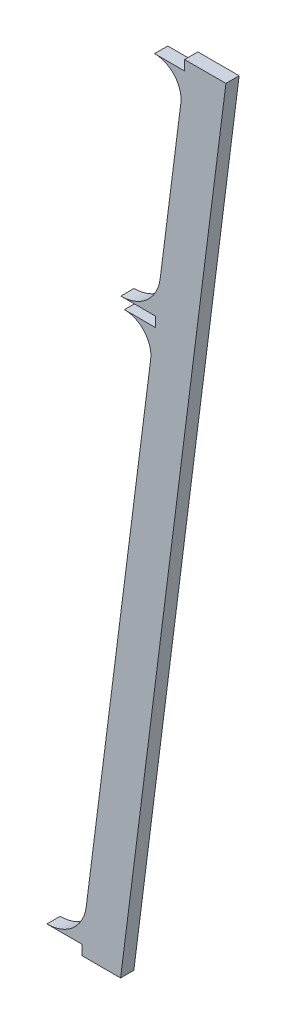
ISO-10303-21;
HEADER;
FILE_DESCRIPTION(('STEP AP214'),'2;1');
FILE_NAME('part.step','',(''),(''),'','','');
FILE_SCHEMA(('AUTOMOTIVE_DESIGN { 1 0 10303 214 1 1 1 1 }'));
ENDSEC;
DATA;
#1=APPLICATION_CONTEXT('core data for automotive mechanical design processes');
#2=APPLICATION_PROTOCOL_DEFINITION('international standard','automotive_design',2000,#1);
#3=PRODUCT_CONTEXT('',#1,'mechanical');
#4=PRODUCT('Part','Part','',(#3));
#5=PRODUCT_RELATED_PRODUCT_CATEGORY('part','',(#4));
#6=PRODUCT_DEFINITION_FORMATION('','',#4);
#7=PRODUCT_DEFINITION_CONTEXT('part definition',#1,'design');
#8=PRODUCT_DEFINITION('design','',#6,#7);
#9=PRODUCT_DEFINITION_SHAPE('','',#8);
#10=(LENGTH_UNIT() NAMED_UNIT(*) SI_UNIT(.MILLI.,.METRE.));
#11=(NAMED_UNIT(*) PLANE_ANGLE_UNIT() SI_UNIT($,.RADIAN.));
#12=(NAMED_UNIT(*) SI_UNIT($,.STERADIAN.) SOLID_ANGLE_UNIT());
#13=UNCERTAINTY_MEASURE_WITH_UNIT(LENGTH_MEASURE(1.E-05),#10,'distance_accuracy_value','');
#14=(GEOMETRIC_REPRESENTATION_CONTEXT(3) GLOBAL_UNCERTAINTY_ASSIGNED_CONTEXT((#13)) GLOBAL_UNIT_ASSIGNED_CONTEXT((#10,
#11,#12)) REPRESENTATION_CONTEXT('',''));
#15=CARTESIAN_POINT('',(0.,0.,0.));
#16=DIRECTION('',(0.,0.,1.));
#17=DIRECTION('',(1.,0.,0.));
#18=AXIS2_PLACEMENT_3D('',#15,#16,#17);
#19=CARTESIAN_POINT('',(21.740638300754,122.216716237368,2.));
#20=DIRECTION('',(0.,0.,-1.));
#21=DIRECTION('',(-1.,0.,0.));
#22=AXIS2_PLACEMENT_3D('',#19,#20,#21);
#23=CYLINDRICAL_SURFACE('',#22,4.);
#24=CARTESIAN_POINT('',(21.740638300754,122.216716237368,0.));
#25=DIRECTION('',(0.,0.,1.));
#26=DIRECTION('',(1.,0.,0.));
#27=AXIS2_PLACEMENT_3D('',#24,#25,#26);
#28=CIRCLE('',#27,4.);
#29=CARTESIAN_POINT('',(25.7086176059875,121.711602157937,0.));
#30=VERTEX_POINT('',#29);
#31=CARTESIAN_POINT('',(21.7406383007547,126.216716237368,0.));
#32=VERTEX_POINT('',#31);
#33=EDGE_CURVE('E178',#30,#32,#28,.T.);
#34=ORIENTED_EDGE('',*,*,#33,.F.);
#35=DIRECTION('',(0.,0.,-1.));
#36=VECTOR('',#35,1.);
#37=CARTESIAN_POINT('',(25.7086176059875,121.711602157937,2.));
#38=LINE('',#37,#36);
#39=CARTESIAN_POINT('',(25.7086176059875,121.711602157937,2.));
#40=VERTEX_POINT('',#39);
#41=EDGE_CURVE('E11',#40,#30,#38,.T.);
#42=ORIENTED_EDGE('',*,*,#41,.F.);
#43=CARTESIAN_POINT('',(21.740638300754,122.216716237368,2.));
#44=DIRECTION('',(0.,0.,1.));
#45=DIRECTION('',(1.,0.,0.));
#46=AXIS2_PLACEMENT_3D('',#43,#44,#45);
#47=CIRCLE('',#46,4.);
#48=CARTESIAN_POINT('',(21.7406383007547,126.216716237368,2.));
#49=VERTEX_POINT('',#48);
#50=EDGE_CURVE('E218',#40,#49,#47,.T.);
#51=ORIENTED_EDGE('',*,*,#50,.T.);
#52=DIRECTION('',(0.,0.,-1.));
#53=VECTOR('',#52,1.);
#54=CARTESIAN_POINT('',(21.7406383007547,126.216716237368,2.));
#55=LINE('',#54,#53);
#56=EDGE_CURVE('E53',#49,#32,#55,.T.);
#57=ORIENTED_EDGE('',*,*,#56,.T.);
#58=EDGE_LOOP('',(#34,#42,#51,#57));
#59=FACE_BOUND('',#58,.T.);
#60=ADVANCED_FACE('F37',(#59),#23,.F.);
#61=CARTESIAN_POINT('',(10.0521362228356,-1.27961240317319,2.));
#62=DIRECTION('',(0.991994826308356,-0.126278519857715,0.));
#63=DIRECTION('',(0.126278519857715,0.991994826308356,0.));
#64=AXIS2_PLACEMENT_3D('',#61,#62,#63);
#65=PLANE('',#64);
#66=DIRECTION('',(-0.126278519857715,-0.991994826308356,0.));
#67=VECTOR('',#66,1.);
#68=CARTESIAN_POINT('',(10.0521362228356,-1.27961240317319,0.));
#69=LINE('',#68,#67);
#70=CARTESIAN_POINT('',(22.5869559561725,97.189045118222,0.));
#71=VERTEX_POINT('',#70);
#72=EDGE_CURVE('E180',#30,#71,#69,.T.);
#73=ORIENTED_EDGE('',*,*,#72,.T.);
#74=DIRECTION('',(0.,0.,-1.));
#75=VECTOR('',#74,1.);
#76=CARTESIAN_POINT('',(22.5869559561725,97.189045118222,2.));
#77=LINE('',#76,#75);
#78=CARTESIAN_POINT('',(22.5869559561725,97.189045118222,2.));
#79=VERTEX_POINT('',#78);
#80=EDGE_CURVE('E45',#79,#71,#77,.T.);
#81=ORIENTED_EDGE('',*,*,#80,.F.);
#82=DIRECTION('',(-0.126278519857715,-0.991994826308356,0.));
#83=VECTOR('',#82,1.);
#84=CARTESIAN_POINT('',(10.0521362228356,-1.27961240317319,2.));
#85=LINE('',#84,#83);
#86=EDGE_CURVE('E504',#40,#79,#85,.T.);
#87=ORIENTED_EDGE('',*,*,#86,.F.);
#88=ORIENTED_EDGE('',*,*,#41,.T.);
#89=EDGE_LOOP('',(#73,#81,#87,#88));
#90=FACE_BOUND('',#89,.T.);
#91=ADVANCED_FACE('F254',(#90),#65,.F.);
#92=CARTESIAN_POINT('',(16.6349869983223,97.9467162373681,2.));
#93=DIRECTION('',(0.,0.,-1.));
#94=DIRECTION('',(-1.,0.,0.));
#95=AXIS2_PLACEMENT_3D('',#92,#93,#94);
#96=CYLINDRICAL_SURFACE('',#95,6.);
#97=CARTESIAN_POINT('',(16.6349869983223,97.9467162373681,0.));
#98=DIRECTION('',(0.,0.,1.));
#99=DIRECTION('',(1.,0.,0.));
#100=AXIS2_PLACEMENT_3D('',#97,#98,#99);
#101=CIRCLE('',#100,6.);
#102=CARTESIAN_POINT('',(16.6349869983223,91.946716237368,0.));
#103=VERTEX_POINT('',#102);
#104=EDGE_CURVE('E183',#103,#71,#101,.T.);
#105=ORIENTED_EDGE('',*,*,#104,.F.);
#106=DIRECTION('',(0.,0.,-1.));
#107=VECTOR('',#106,1.);
#108=CARTESIAN_POINT('',(16.6349869983223,91.946716237368,2.));
#109=LINE('',#108,#107);
#110=CARTESIAN_POINT('',(16.6349869983223,91.946716237368,2.));
#111=VERTEX_POINT('',#110);
#112=EDGE_CURVE('E244',#111,#103,#109,.T.);
#113=ORIENTED_EDGE('',*,*,#112,.F.);
#114=CARTESIAN_POINT('',(16.6349869983223,97.9467162373681,2.));
#115=DIRECTION('',(0.,0.,1.));
#116=DIRECTION('',(1.,0.,0.));
#117=AXIS2_PLACEMENT_3D('',#114,#115,#116);
#118=CIRCLE('',#117,6.);
#119=EDGE_CURVE('E251',#111,#79,#118,.T.);
#120=ORIENTED_EDGE('',*,*,#119,.T.);
#121=ORIENTED_EDGE('',*,*,#80,.T.);
#122=EDGE_LOOP('',(#105,#113,#120,#121));
#123=FACE_BOUND('',#122,.T.);
#124=ADVANCED_FACE('F249',(#123),#96,.F.);
#125=CARTESIAN_POINT('',(0.,91.946716237368,2.));
#126=DIRECTION('',(0.,1.,0.));
#127=DIRECTION('',(0.,0.,1.));
#128=AXIS2_PLACEMENT_3D('',#125,#126,#127);
#129=PLANE('',#128);
#130=DIRECTION('',(1.,0.,0.));
#131=VECTOR('',#130,1.);
#132=CARTESIAN_POINT('',(0.,91.946716237368,0.));
#133=LINE('',#132,#131);
#134=CARTESIAN_POINT('',(21.919620286546,91.946716237368,0.));
#135=VERTEX_POINT('',#134);
#136=EDGE_CURVE('E186',#103,#135,#133,.T.);
#137=ORIENTED_EDGE('',*,*,#136,.T.);
#138=DIRECTION('',(0.,0.,-1.));
#139=VECTOR('',#138,1.);
#140=CARTESIAN_POINT('',(21.919620286546,91.946716237368,2.));
#141=LINE('',#140,#139);
#142=CARTESIAN_POINT('',(21.919620286546,91.946716237368,2.));
#143=VERTEX_POINT('',#142);
#144=EDGE_CURVE('E241',#143,#135,#141,.T.);
#145=ORIENTED_EDGE('',*,*,#144,.F.);
#146=DIRECTION('',(1.,0.,0.));
#147=VECTOR('',#146,1.);
#148=CARTESIAN_POINT('',(0.,91.946716237368,2.));
#149=LINE('',#148,#147);
#150=EDGE_CURVE('E271',#111,#143,#149,.T.);
#151=ORIENTED_EDGE('',*,*,#150,.F.);
#152=ORIENTED_EDGE('',*,*,#112,.T.);
#153=EDGE_LOOP('',(#137,#145,#151,#152));
#154=FACE_BOUND('',#153,.T.);
#155=ADVANCED_FACE('F262',(#154),#129,.F.);
#156=CARTESIAN_POINT('',(21.919620286546,0.,2.));
#157=DIRECTION('',(1.,0.,0.));
#158=DIRECTION('',(0.,0.,-1.));
#159=AXIS2_PLACEMENT_3D('',#156,#157,#158);
#160=PLANE('',#159);
#161=DIRECTION('',(0.,-1.,0.));
#162=VECTOR('',#161,1.);
#163=CARTESIAN_POINT('',(21.919620286546,0.,0.));
#164=LINE('',#163,#162);
#165=CARTESIAN_POINT('',(21.919620286546,90.446716237368,0.));
#166=VERTEX_POINT('',#165);
#167=EDGE_CURVE('E188',#135,#166,#164,.T.);
#168=ORIENTED_EDGE('',*,*,#167,.T.);
#169=DIRECTION('',(0.,0.,-1.));
#170=VECTOR('',#169,1.);
#171=CARTESIAN_POINT('',(21.919620286546,90.446716237368,2.));
#172=LINE('',#171,#170);
#173=CARTESIAN_POINT('',(21.919620286546,90.446716237368,2.));
#174=VERTEX_POINT('',#173);
#175=EDGE_CURVE('E238',#174,#166,#172,.T.);
#176=ORIENTED_EDGE('',*,*,#175,.F.);
#177=DIRECTION('',(0.,-1.,0.));
#178=VECTOR('',#177,1.);
#179=CARTESIAN_POINT('',(21.919620286546,0.,2.));
#180=LINE('',#179,#178);
#181=EDGE_CURVE('E268',#143,#174,#180,.T.);
#182=ORIENTED_EDGE('',*,*,#181,.F.);
#183=ORIENTED_EDGE('',*,*,#144,.T.);
#184=EDGE_LOOP('',(#168,#176,#182,#183));
#185=FACE_BOUND('',#184,.T.);
#186=ADVANCED_FACE('F266',(#185),#160,.F.);
#187=CARTESIAN_POINT('',(0.,90.446716237368,2.));
#188=DIRECTION('',(0.,-1.,0.));
#189=DIRECTION('',(0.,0.,-1.));
#190=AXIS2_PLACEMENT_3D('',#187,#188,#189);
#191=PLANE('',#190);
#192=DIRECTION('',(-1.,0.,0.));
#193=VECTOR('',#192,1.);
#194=CARTESIAN_POINT('',(0.,90.446716237368,0.));
#195=LINE('',#194,#193);
#196=CARTESIAN_POINT('',(17.1872046179214,90.446716237368,0.));
#197=VERTEX_POINT('',#196);
#198=EDGE_CURVE('E190',#166,#197,#195,.T.);
#199=ORIENTED_EDGE('',*,*,#198,.T.);
#200=DIRECTION('',(0.,0.,-1.));
#201=VECTOR('',#200,1.);
#202=CARTESIAN_POINT('',(17.1872046179214,90.446716237368,2.));
#203=LINE('',#202,#201);
#204=CARTESIAN_POINT('',(17.1872046179214,90.446716237368,2.));
#205=VERTEX_POINT('',#204);
#206=EDGE_CURVE('E236',#205,#197,#203,.T.);
#207=ORIENTED_EDGE('',*,*,#206,.F.);
#208=DIRECTION('',(-1.,0.,0.));
#209=VECTOR('',#208,1.);
#210=CARTESIAN_POINT('',(0.,90.446716237368,2.));
#211=LINE('',#210,#209);
#212=EDGE_CURVE('E270',#174,#205,#211,.T.);
#213=ORIENTED_EDGE('',*,*,#212,.F.);
#214=ORIENTED_EDGE('',*,*,#175,.T.);
#215=EDGE_LOOP('',(#199,#207,#213,#214));
#216=FACE_BOUND('',#215,.T.);
#217=ADVANCED_FACE('F319',(#216),#191,.F.);
#218=CARTESIAN_POINT('',(17.1872046179208,86.446716237368,2.));
#219=DIRECTION('',(0.,0.,-1.));
#220=DIRECTION('',(-1.,0.,0.));
#221=AXIS2_PLACEMENT_3D('',#218,#219,#220);
#222=CYLINDRICAL_SURFACE('',#221,4.);
#223=CARTESIAN_POINT('',(17.1872046179208,86.446716237368,0.));
#224=DIRECTION('',(0.,0.,1.));
#225=DIRECTION('',(1.,0.,0.));
#226=AXIS2_PLACEMENT_3D('',#223,#224,#225);
#227=CIRCLE('',#226,4.);
#228=CARTESIAN_POINT('',(21.1551839231543,85.9416021579375,0.));
#229=VERTEX_POINT('',#228);
#230=EDGE_CURVE('E193',#229,#197,#227,.T.);
#231=ORIENTED_EDGE('',*,*,#230,.F.);
#232=DIRECTION('',(0.,0.,-1.));
#233=VECTOR('',#232,1.);
#234=CARTESIAN_POINT('',(21.1551839231543,85.9416021579375,2.));
#235=LINE('',#234,#233);
#236=CARTESIAN_POINT('',(21.1551839231543,85.9416021579375,2.));
#237=VERTEX_POINT('',#236);
#238=EDGE_CURVE('E234',#237,#229,#235,.T.);
#239=ORIENTED_EDGE('',*,*,#238,.F.);
#240=CARTESIAN_POINT('',(17.1872046179208,86.446716237368,2.));
#241=DIRECTION('',(0.,0.,1.));
#242=DIRECTION('',(1.,0.,0.));
#243=AXIS2_PLACEMENT_3D('',#240,#241,#242);
#244=CIRCLE('',#243,4.);
#245=EDGE_CURVE('E273',#237,#205,#244,.T.);
#246=ORIENTED_EDGE('',*,*,#245,.T.);
#247=ORIENTED_EDGE('',*,*,#206,.T.);
#248=EDGE_LOOP('',(#231,#239,#246,#247));
#249=FACE_BOUND('',#248,.T.);
#250=ADVANCED_FACE('F322',(#249),#222,.F.);
#251=CARTESIAN_POINT('',(10.0521362228405,-1.27961240317344,2.));
#252=DIRECTION('',(-0.99199482630836,0.12627851985768,0.));
#253=DIRECTION('',(-0.12627851985768,-0.99199482630836,0.));
#254=AXIS2_PLACEMENT_3D('',#251,#252,#253);
#255=PLANE('',#254);
#256=DIRECTION('',(0.12627851985768,0.99199482630836,0.));
#257=VECTOR('',#256,1.);
#258=CARTESIAN_POINT('',(10.0521362228405,-1.27961240317344,0.));
#259=LINE('',#258,#257);
#260=CARTESIAN_POINT('',(11.4191411114716,9.4590451182215,0.));
#261=VERTEX_POINT('',#260);
#262=EDGE_CURVE('E196',#261,#229,#259,.T.);
#263=ORIENTED_EDGE('',*,*,#262,.F.);
#264=DIRECTION('',(0.,0.,-1.));
#265=VECTOR('',#264,1.);
#266=CARTESIAN_POINT('',(11.4191411114716,9.4590451182215,2.));
#267=LINE('',#266,#265);
#268=CARTESIAN_POINT('',(11.4191411114716,9.4590451182215,2.));
#269=VERTEX_POINT('',#268);
#270=EDGE_CURVE('E232',#269,#261,#267,.T.);
#271=ORIENTED_EDGE('',*,*,#270,.F.);
#272=DIRECTION('',(0.12627851985768,0.99199482630836,0.));
#273=VECTOR('',#272,1.);
#274=CARTESIAN_POINT('',(10.0521362228405,-1.27961240317344,2.));
#275=LINE('',#274,#273);
#276=EDGE_CURVE('E280',#269,#237,#275,.T.);
#277=ORIENTED_EDGE('',*,*,#276,.T.);
#278=ORIENTED_EDGE('',*,*,#238,.T.);
#279=EDGE_LOOP('',(#263,#271,#277,#278));
#280=FACE_BOUND('',#279,.T.);
#281=ADVANCED_FACE('F326',(#280),#255,.T.);
#282=CARTESIAN_POINT('',(5.46717215362151,10.216716237368,2.));
#283=DIRECTION('',(0.,0.,-1.));
#284=DIRECTION('',(-1.,0.,0.));
#285=AXIS2_PLACEMENT_3D('',#282,#283,#284);
#286=CYLINDRICAL_SURFACE('',#285,6.);
#287=CARTESIAN_POINT('',(5.46717215362151,10.216716237368,0.));
#288=DIRECTION('',(0.,0.,1.));
#289=DIRECTION('',(1.,0.,0.));
#290=AXIS2_PLACEMENT_3D('',#287,#288,#289);
#291=CIRCLE('',#290,6.);
#292=CARTESIAN_POINT('',(5.4671721536215,4.21671623736802,0.));
#293=VERTEX_POINT('',#292);
#294=EDGE_CURVE('E199',#293,#261,#291,.T.);
#295=ORIENTED_EDGE('',*,*,#294,.F.);
#296=DIRECTION('',(0.,0.,-1.));
#297=VECTOR('',#296,1.);
#298=CARTESIAN_POINT('',(5.4671721536215,4.21671623736802,2.));
#299=LINE('',#298,#297);
#300=CARTESIAN_POINT('',(5.4671721536215,4.21671623736802,2.));
#301=VERTEX_POINT('',#300);
#302=EDGE_CURVE('E230',#301,#293,#299,.T.);
#303=ORIENTED_EDGE('',*,*,#302,.F.);
#304=CARTESIAN_POINT('',(5.46717215362151,10.216716237368,2.));
#305=DIRECTION('',(0.,0.,1.));
#306=DIRECTION('',(1.,0.,0.));
#307=AXIS2_PLACEMENT_3D('',#304,#305,#306);
#308=CIRCLE('',#307,6.);
#309=EDGE_CURVE('E283',#301,#269,#308,.T.);
#310=ORIENTED_EDGE('',*,*,#309,.T.);
#311=ORIENTED_EDGE('',*,*,#270,.T.);
#312=EDGE_LOOP('',(#295,#303,#310,#311));
#313=FACE_BOUND('',#312,.T.);
#314=ADVANCED_FACE('F330',(#313),#286,.F.);
#315=CARTESIAN_POINT('',(0.,4.21671623736802,2.));
#316=DIRECTION('',(0.,1.,0.));
#317=DIRECTION('',(0.,0.,1.));
#318=AXIS2_PLACEMENT_3D('',#315,#316,#317);
#319=PLANE('',#318);
#320=DIRECTION('',(1.,0.,0.));
#321=VECTOR('',#320,1.);
#322=CARTESIAN_POINT('',(0.,4.21671623736802,0.));
#323=LINE('',#322,#321);
#324=CARTESIAN_POINT('',(10.7518054418433,4.21671623736802,0.));
#325=VERTEX_POINT('',#324);
#326=EDGE_CURVE('E202',#293,#325,#323,.T.);
#327=ORIENTED_EDGE('',*,*,#326,.T.);
#328=DIRECTION('',(0.,0.,-1.));
#329=VECTOR('',#328,1.);
#330=CARTESIAN_POINT('',(10.7518054418433,4.21671623736802,2.));
#331=LINE('',#330,#329);
#332=CARTESIAN_POINT('',(10.7518054418433,4.21671623736802,2.));
#333=VERTEX_POINT('',#332);
#334=EDGE_CURVE('E227',#333,#325,#331,.T.);
#335=ORIENTED_EDGE('',*,*,#334,.F.);
#336=DIRECTION('',(1.,0.,0.));
#337=VECTOR('',#336,1.);
#338=CARTESIAN_POINT('',(0.,4.21671623736802,2.));
#339=LINE('',#338,#337);
#340=EDGE_CURVE('E286',#301,#333,#339,.T.);
#341=ORIENTED_EDGE('',*,*,#340,.F.);
#342=ORIENTED_EDGE('',*,*,#302,.T.);
#343=EDGE_LOOP('',(#327,#335,#341,#342));
#344=FACE_BOUND('',#343,.T.);
#345=ADVANCED_FACE('F334',(#344),#319,.F.);
#346=CARTESIAN_POINT('',(10.7518054418484,1.3043552243506E-11,2.));
#347=DIRECTION('',(1.,1.21314995086663E-12,0.));
#348=DIRECTION('',(-1.21314995086663E-12,1.,0.));
#349=AXIS2_PLACEMENT_3D('',#346,#347,#348);
#350=PLANE('',#349);
#351=DIRECTION('',(1.21314995086663E-12,-1.,0.));
#352=VECTOR('',#351,1.);
#353=CARTESIAN_POINT('',(10.7518054418484,1.3043552243506E-11,0.));
#354=LINE('',#353,#352);
#355=CARTESIAN_POINT('',(10.7518054418451,2.71671623736825,0.));
#356=VERTEX_POINT('',#355);
#357=EDGE_CURVE('E204',#325,#356,#354,.T.);
#358=ORIENTED_EDGE('',*,*,#357,.T.);
#359=DIRECTION('',(0.,0.,-1.));
#360=VECTOR('',#359,1.);
#361=CARTESIAN_POINT('',(10.7518054418451,2.71671623736825,2.));
#362=LINE('',#361,#360);
#363=CARTESIAN_POINT('',(10.7518054418451,2.71671623736825,2.));
#364=VERTEX_POINT('',#363);
#365=EDGE_CURVE('E224',#364,#356,#362,.T.);
#366=ORIENTED_EDGE('',*,*,#365,.F.);
#367=DIRECTION('',(1.21314995086663E-12,-1.,0.));
#368=VECTOR('',#367,1.);
#369=CARTESIAN_POINT('',(10.7518054418484,1.3043552243506E-11,2.));
#370=LINE('',#369,#368);
#371=EDGE_CURVE('E288',#333,#364,#370,.T.);
#372=ORIENTED_EDGE('',*,*,#371,.F.);
#373=ORIENTED_EDGE('',*,*,#334,.T.);
#374=EDGE_LOOP('',(#358,#366,#372,#373));
#375=FACE_BOUND('',#374,.T.);
#376=ADVANCED_FACE('F338',(#375),#350,.F.);
#377=CARTESIAN_POINT('',(1.05398780556924E-13,2.71671623736866,2.));
#378=DIRECTION('',(0.,1.,0.));
#379=DIRECTION('',(-1.,0.,0.));
#380=AXIS2_PLACEMENT_3D('',#377,#378,#379);
#381=PLANE('',#380);
#382=DIRECTION('',(1.,0.,0.));
#383=VECTOR('',#382,1.);
#384=CARTESIAN_POINT('',(1.05398780556924E-13,2.71671623736866,0.));
#385=LINE('',#384,#383);
#386=CARTESIAN_POINT('',(16.6092777452377,2.71671623736802,0.));
#387=VERTEX_POINT('',#386);
#388=EDGE_CURVE('E206',#356,#387,#385,.T.);
#389=ORIENTED_EDGE('',*,*,#388,.T.);
#390=DIRECTION('',(0.,0.,-1.));
#391=VECTOR('',#390,1.);
#392=CARTESIAN_POINT('',(16.6092777452377,2.71671623736802,2.));
#393=LINE('',#392,#391);
#394=CARTESIAN_POINT('',(16.6092777452377,2.71671623736802,2.));
#395=VERTEX_POINT('',#394);
#396=EDGE_CURVE('E222',#395,#387,#393,.T.);
#397=ORIENTED_EDGE('',*,*,#396,.F.);
#398=DIRECTION('',(1.,0.,0.));
#399=VECTOR('',#398,1.);
#400=CARTESIAN_POINT('',(1.05398780556924E-13,2.71671623736866,2.));
#401=LINE('',#400,#399);
#402=EDGE_CURVE('E290',#364,#395,#401,.T.);
#403=ORIENTED_EDGE('',*,*,#402,.F.);
#404=ORIENTED_EDGE('',*,*,#365,.T.);
#405=EDGE_LOOP('',(#389,#397,#403,#404));
#406=FACE_BOUND('',#405,.T.);
#407=ADVANCED_FACE('F342',(#406),#381,.F.);
#408=CARTESIAN_POINT('',(16.0041051806879,-2.03728352231938,2.));
#409=DIRECTION('',(0.991994826308359,-0.126278519857692,0.));
#410=DIRECTION('',(0.126278519857692,0.991994826308359,0.));
#411=AXIS2_PLACEMENT_3D('',#408,#409,#410);
#412=PLANE('',#411);
#413=DIRECTION('',(-0.126278519857692,-0.991994826308359,0.));
#414=VECTOR('',#413,1.);
#415=CARTESIAN_POINT('',(16.0041051806879,-2.03728352231938,0.));
#416=LINE('',#415,#414);
#417=CARTESIAN_POINT('',(32.5214726111662,127.716716237368,0.));
#418=VERTEX_POINT('',#417);
#419=EDGE_CURVE('E209',#418,#387,#416,.T.);
#420=ORIENTED_EDGE('',*,*,#419,.F.);
#421=DIRECTION('',(0.,0.,-1.));
#422=VECTOR('',#421,1.);
#423=CARTESIAN_POINT('',(32.5214726111662,127.716716237368,2.));
#424=LINE('',#423,#422);
#425=CARTESIAN_POINT('',(32.5214726111662,127.716716237368,2.));
#426=VERTEX_POINT('',#425);
#427=EDGE_CURVE('E160',#426,#418,#424,.T.);
#428=ORIENTED_EDGE('',*,*,#427,.F.);
#429=DIRECTION('',(-0.126278519857692,-0.991994826308359,0.));
#430=VECTOR('',#429,1.);
#431=CARTESIAN_POINT('',(16.0041051806879,-2.03728352231938,2.));
#432=LINE('',#431,#430);
#433=EDGE_CURVE('E170',#426,#395,#432,.T.);
#434=ORIENTED_EDGE('',*,*,#433,.T.);
#435=ORIENTED_EDGE('',*,*,#396,.T.);
#436=EDGE_LOOP('',(#420,#428,#434,#435));
#437=FACE_BOUND('',#436,.T.);
#438=ADVANCED_FACE('F293',(#437),#412,.T.);
#439=CARTESIAN_POINT('',(0.,127.716716237368,2.));
#440=DIRECTION('',(0.,1.,0.));
#441=DIRECTION('',(0.,0.,1.));
#442=AXIS2_PLACEMENT_3D('',#439,#440,#441);
#443=PLANE('',#442);
#444=DIRECTION('',(1.,0.,0.));
#445=VECTOR('',#444,1.);
#446=CARTESIAN_POINT('',(0.,127.716716237368,0.));
#447=LINE('',#446,#445);
#448=CARTESIAN_POINT('',(26.2821076309883,127.716716237368,0.));
#449=VERTEX_POINT('',#448);
#450=EDGE_CURVE('E156',#449,#418,#447,.T.);
#451=ORIENTED_EDGE('',*,*,#450,.F.);
#452=DIRECTION('',(0.,0.,-1.));
#453=VECTOR('',#452,1.);
#454=CARTESIAN_POINT('',(26.2821076309883,127.716716237368,2.));
#455=LINE('',#454,#453);
#456=CARTESIAN_POINT('',(26.2821076309883,127.716716237368,2.));
#457=VERTEX_POINT('',#456);
#458=EDGE_CURVE('E151',#457,#449,#455,.T.);
#459=ORIENTED_EDGE('',*,*,#458,.F.);
#460=DIRECTION('',(1.,0.,0.));
#461=VECTOR('',#460,1.);
#462=CARTESIAN_POINT('',(0.,127.716716237368,2.));
#463=LINE('',#462,#461);
#464=EDGE_CURVE('E154',#457,#426,#463,.T.);
#465=ORIENTED_EDGE('',*,*,#464,.T.);
#466=ORIENTED_EDGE('',*,*,#427,.T.);
#467=EDGE_LOOP('',(#451,#459,#465,#466));
#468=FACE_BOUND('',#467,.T.);
#469=ADVANCED_FACE('F153',(#468),#443,.T.);
#470=CARTESIAN_POINT('',(26.2821076309883,0.,2.));
#471=DIRECTION('',(-1.,0.,0.));
#472=DIRECTION('',(0.,0.,1.));
#473=AXIS2_PLACEMENT_3D('',#470,#471,#472);
#474=PLANE('',#473);
#475=DIRECTION('',(0.,1.,0.));
#476=VECTOR('',#475,1.);
#477=CARTESIAN_POINT('',(26.2821076309883,0.,0.));
#478=LINE('',#477,#476);
#479=CARTESIAN_POINT('',(26.2821076309883,126.216716237368,0.));
#480=VERTEX_POINT('',#479);
#481=EDGE_CURVE('E213',#480,#449,#478,.T.);
#482=ORIENTED_EDGE('',*,*,#481,.F.);
#483=DIRECTION('',(0.,0.,-1.));
#484=VECTOR('',#483,1.);
#485=CARTESIAN_POINT('',(26.2821076309883,126.216716237368,2.));
#486=LINE('',#485,#484);
#487=CARTESIAN_POINT('',(26.2821076309883,126.216716237368,2.));
#488=VERTEX_POINT('',#487);
#489=EDGE_CURVE('E102',#488,#480,#486,.T.);
#490=ORIENTED_EDGE('',*,*,#489,.F.);
#491=DIRECTION('',(0.,1.,0.));
#492=VECTOR('',#491,1.);
#493=CARTESIAN_POINT('',(26.2821076309883,0.,2.));
#494=LINE('',#493,#492);
#495=EDGE_CURVE('E168',#488,#457,#494,.T.);
#496=ORIENTED_EDGE('',*,*,#495,.T.);
#497=ORIENTED_EDGE('',*,*,#458,.T.);
#498=EDGE_LOOP('',(#482,#490,#496,#497));
#499=FACE_BOUND('',#498,.T.);
#500=ADVANCED_FACE('F172',(#499),#474,.T.);
#501=CARTESIAN_POINT('',(0.,126.216716237368,2.));
#502=DIRECTION('',(0.,1.,0.));
#503=DIRECTION('',(0.,0.,1.));
#504=AXIS2_PLACEMENT_3D('',#501,#502,#503);
#505=PLANE('',#504);
#506=DIRECTION('',(1.,0.,0.));
#507=VECTOR('',#506,1.);
#508=CARTESIAN_POINT('',(0.,126.216716237368,0.));
#509=LINE('',#508,#507);
#510=EDGE_CURVE('E215',#32,#480,#509,.T.);
#511=ORIENTED_EDGE('',*,*,#510,.F.);
#512=ORIENTED_EDGE('',*,*,#56,.F.);
#513=DIRECTION('',(1.,0.,0.));
#514=VECTOR('',#513,1.);
#515=CARTESIAN_POINT('',(0.,126.216716237368,2.));
#516=LINE('',#515,#514);
#517=EDGE_CURVE('E173',#49,#488,#516,.T.);
#518=ORIENTED_EDGE('',*,*,#517,.T.);
#519=ORIENTED_EDGE('',*,*,#489,.T.);
#520=EDGE_LOOP('',(#511,#512,#518,#519));
#521=FACE_BOUND('',#520,.T.);
#522=ADVANCED_FACE('F296',(#521),#505,.T.);
#523=CARTESIAN_POINT('',(0.,0.,2.));
#524=DIRECTION('',(0.,0.,1.));
#525=DIRECTION('',(1.,0.,0.));
#526=AXIS2_PLACEMENT_3D('',#523,#524,#525);
#527=PLANE('',#526);
#528=ORIENTED_EDGE('',*,*,#50,.F.);
#529=ORIENTED_EDGE('',*,*,#86,.T.);
#530=ORIENTED_EDGE('',*,*,#119,.F.);
#531=ORIENTED_EDGE('',*,*,#150,.T.);
#532=ORIENTED_EDGE('',*,*,#181,.T.);
#533=ORIENTED_EDGE('',*,*,#212,.T.);
#534=ORIENTED_EDGE('',*,*,#245,.F.);
#535=ORIENTED_EDGE('',*,*,#276,.F.);
#536=ORIENTED_EDGE('',*,*,#309,.F.);
#537=ORIENTED_EDGE('',*,*,#340,.T.);
#538=ORIENTED_EDGE('',*,*,#371,.T.);
#539=ORIENTED_EDGE('',*,*,#402,.T.);
#540=ORIENTED_EDGE('',*,*,#433,.F.);
#541=ORIENTED_EDGE('',*,*,#464,.F.);
#542=ORIENTED_EDGE('',*,*,#495,.F.);
#543=ORIENTED_EDGE('',*,*,#517,.F.);
#544=EDGE_LOOP('',(#528,#529,#530,#531,#532,#533,#534,#535,#536,#537,#538,#539,#540,#541,#542,#543));
#545=FACE_BOUND('',#544,.T.);
#546=ADVANCED_FACE('F166',(#545),#527,.T.);
#547=CARTESIAN_POINT('',(0.,0.,0.));
#548=DIRECTION('',(0.,0.,1.));
#549=DIRECTION('',(1.,0.,0.));
#550=AXIS2_PLACEMENT_3D('',#547,#548,#549);
#551=PLANE('',#550);
#552=ORIENTED_EDGE('',*,*,#33,.T.);
#553=ORIENTED_EDGE('',*,*,#510,.T.);
#554=ORIENTED_EDGE('',*,*,#481,.T.);
#555=ORIENTED_EDGE('',*,*,#450,.T.);
#556=ORIENTED_EDGE('',*,*,#419,.T.);
#557=ORIENTED_EDGE('',*,*,#388,.F.);
#558=ORIENTED_EDGE('',*,*,#357,.F.);
#559=ORIENTED_EDGE('',*,*,#326,.F.);
#560=ORIENTED_EDGE('',*,*,#294,.T.);
#561=ORIENTED_EDGE('',*,*,#262,.T.);
#562=ORIENTED_EDGE('',*,*,#230,.T.);
#563=ORIENTED_EDGE('',*,*,#198,.F.);
#564=ORIENTED_EDGE('',*,*,#167,.F.);
#565=ORIENTED_EDGE('',*,*,#136,.F.);
#566=ORIENTED_EDGE('',*,*,#104,.T.);
#567=ORIENTED_EDGE('',*,*,#72,.F.);
#568=EDGE_LOOP('',(#552,#553,#554,#555,#556,#557,#558,#559,#560,#561,#562,#563,#564,#565,#566,#567));
#569=FACE_BOUND('',#568,.T.);
#570=ADVANCED_FACE('F257',(#569),#551,.F.);
#571=CLOSED_SHELL('',(#60,#91,#124,#155,#186,#217,#250,#281,#314,#345,#376,#407,#438,#469,#500,
#522,#546,#570));
#572=MANIFOLD_SOLID_BREP('B2',#571);
#573=ADVANCED_BREP_SHAPE_REPRESENTATION('',(#18,#572),#14);
#574=SHAPE_DEFINITION_REPRESENTATION(#9,#573);
ENDSEC;
END-ISO-10303-21;
